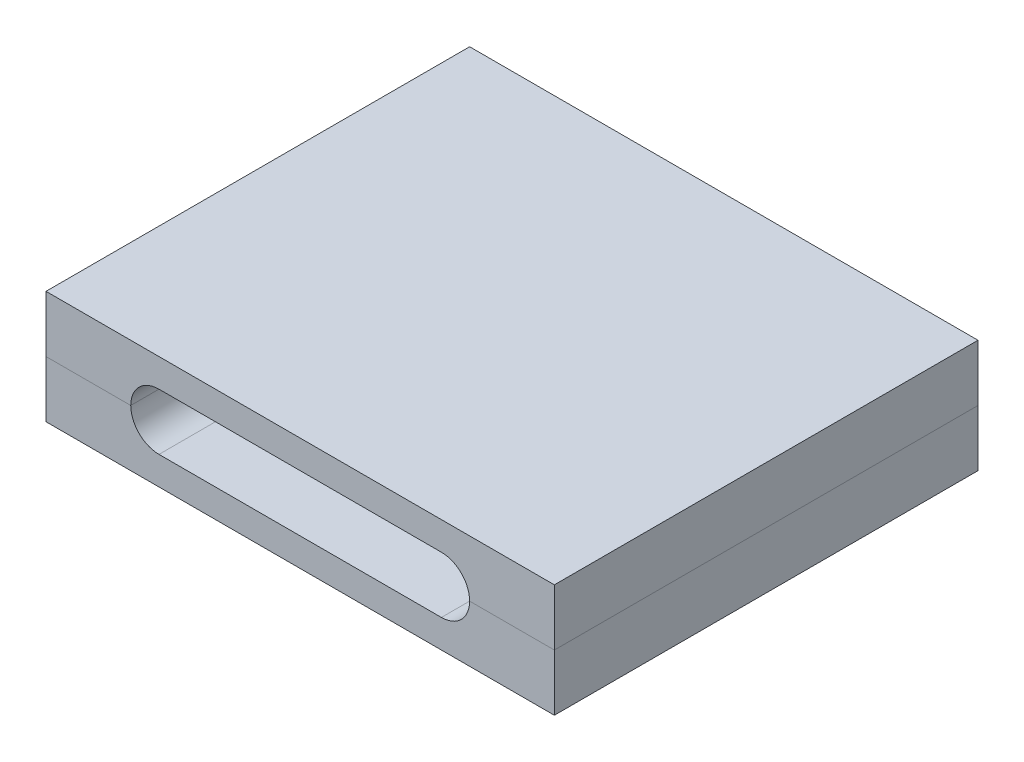
ISO-10303-21;
HEADER;
FILE_DESCRIPTION(('STEP AP214'),'2;1');
FILE_NAME('part.step','',(''),(''),'','','');
FILE_SCHEMA(('AUTOMOTIVE_DESIGN { 1 0 10303 214 1 1 1 1 }'));
ENDSEC;
DATA;
#1=APPLICATION_CONTEXT('core data for automotive mechanical design processes');
#2=APPLICATION_PROTOCOL_DEFINITION('international standard','automotive_design',2000,#1);
#3=PRODUCT_CONTEXT('',#1,'mechanical');
#4=PRODUCT('Part','Part','',(#3));
#5=PRODUCT_RELATED_PRODUCT_CATEGORY('part','',(#4));
#6=PRODUCT_DEFINITION_FORMATION('','',#4);
#7=PRODUCT_DEFINITION_CONTEXT('part definition',#1,'design');
#8=PRODUCT_DEFINITION('design','',#6,#7);
#9=PRODUCT_DEFINITION_SHAPE('','',#8);
#10=(LENGTH_UNIT() NAMED_UNIT(*) SI_UNIT(.MILLI.,.METRE.));
#11=(NAMED_UNIT(*) PLANE_ANGLE_UNIT() SI_UNIT($,.RADIAN.));
#12=(NAMED_UNIT(*) SI_UNIT($,.STERADIAN.) SOLID_ANGLE_UNIT());
#13=UNCERTAINTY_MEASURE_WITH_UNIT(LENGTH_MEASURE(1.E-05),#10,'distance_accuracy_value','');
#14=(GEOMETRIC_REPRESENTATION_CONTEXT(3) GLOBAL_UNCERTAINTY_ASSIGNED_CONTEXT((#13)) GLOBAL_UNIT_ASSIGNED_CONTEXT((#10,
#11,#12)) REPRESENTATION_CONTEXT('',''));
#15=CARTESIAN_POINT('',(0.,0.,0.));
#16=DIRECTION('',(0.,0.,1.));
#17=DIRECTION('',(1.,0.,0.));
#18=AXIS2_PLACEMENT_3D('',#15,#16,#17);
#19=CARTESIAN_POINT('',(9.,0.,-0.00999999999999959));
#20=DIRECTION('',(0.,1.,0.));
#21=DIRECTION('',(0.,0.,1.));
#22=AXIS2_PLACEMENT_3D('',#19,#20,#21);
#23=PLANE('',#22);
#24=DIRECTION('',(0.,0.,-1.));
#25=VECTOR('',#24,1.);
#26=CARTESIAN_POINT('',(-6.,0.,15.));
#27=LINE('',#26,#25);
#28=CARTESIAN_POINT('',(-6.,0.,0.));
#29=VERTEX_POINT('',#28);
#30=CARTESIAN_POINT('',(-6.,0.,15.));
#31=VERTEX_POINT('',#30);
#32=EDGE_CURVE('E150',#29,#31,#27,.F.);
#33=ORIENTED_EDGE('',*,*,#32,.F.);
#34=DIRECTION('',(-1.,0.,0.));
#35=VECTOR('',#34,1.);
#36=CARTESIAN_POINT('',(0.,0.,0.));
#37=LINE('',#36,#35);
#38=CARTESIAN_POINT('',(-9.,0.,0.));
#39=VERTEX_POINT('',#38);
#40=EDGE_CURVE('E157',#29,#39,#37,.T.);
#41=ORIENTED_EDGE('',*,*,#40,.T.);
#42=DIRECTION('',(0.,0.,1.));
#43=VECTOR('',#42,1.);
#44=CARTESIAN_POINT('',(-9.,0.,15.));
#45=LINE('',#44,#43);
#46=CARTESIAN_POINT('',(-9.,0.,15.));
#47=VERTEX_POINT('',#46);
#48=EDGE_CURVE('E166',#39,#47,#45,.T.);
#49=ORIENTED_EDGE('',*,*,#48,.T.);
#50=DIRECTION('',(-1.,0.,0.));
#51=VECTOR('',#50,1.);
#52=CARTESIAN_POINT('',(0.,0.,15.));
#53=LINE('',#52,#51);
#54=EDGE_CURVE('E109',#31,#47,#53,.T.);
#55=ORIENTED_EDGE('',*,*,#54,.F.);
#56=EDGE_LOOP('',(#33,#41,#49,#55));
#57=FACE_BOUND('',#56,.T.);
#58=ADVANCED_FACE('F49',(#57),#23,.T.);
#59=DIRECTION('',(0.,0.,-1.));
#60=VECTOR('',#59,1.);
#61=CARTESIAN_POINT('',(9.,0.,15.));
#62=LINE('',#61,#60);
#63=CARTESIAN_POINT('',(9.,0.,15.));
#64=VERTEX_POINT('',#63);
#65=CARTESIAN_POINT('',(9.,0.,0.));
#66=VERTEX_POINT('',#65);
#67=EDGE_CURVE('E162',#64,#66,#62,.T.);
#68=ORIENTED_EDGE('',*,*,#67,.T.);
#69=CARTESIAN_POINT('',(6.,0.,0.));
#70=VERTEX_POINT('',#69);
#71=EDGE_CURVE('E161',#66,#70,#37,.T.);
#72=ORIENTED_EDGE('',*,*,#71,.T.);
#73=DIRECTION('',(0.,0.,-1.));
#74=VECTOR('',#73,1.);
#75=CARTESIAN_POINT('',(6.,0.,15.));
#76=LINE('',#75,#74);
#77=CARTESIAN_POINT('',(6.,0.,15.));
#78=VERTEX_POINT('',#77);
#79=EDGE_CURVE('E120',#78,#70,#76,.T.);
#80=ORIENTED_EDGE('',*,*,#79,.F.);
#81=EDGE_CURVE('E156',#64,#78,#53,.T.);
#82=ORIENTED_EDGE('',*,*,#81,.F.);
#83=EDGE_LOOP('',(#68,#72,#80,#82));
#84=FACE_BOUND('',#83,.T.);
#85=ADVANCED_FACE('F195',(#84),#23,.T.);
#86=CARTESIAN_POINT('',(-9.,-2.,15.));
#87=DIRECTION('',(0.,1.,0.));
#88=DIRECTION('',(0.,0.,1.));
#89=AXIS2_PLACEMENT_3D('',#86,#87,#88);
#90=PLANE('',#89);
#91=DIRECTION('',(1.,0.,0.));
#92=VECTOR('',#91,1.);
#93=CARTESIAN_POINT('',(-9.,-2.,0.));
#94=LINE('',#93,#92);
#95=CARTESIAN_POINT('',(-9.,-2.,0.));
#96=VERTEX_POINT('',#95);
#97=CARTESIAN_POINT('',(9.,-2.,0.));
#98=VERTEX_POINT('',#97);
#99=EDGE_CURVE('E131',#96,#98,#94,.T.);
#100=ORIENTED_EDGE('',*,*,#99,.T.);
#101=DIRECTION('',(0.,0.,-1.));
#102=VECTOR('',#101,1.);
#103=CARTESIAN_POINT('',(9.,-2.,15.));
#104=LINE('',#103,#102);
#105=CARTESIAN_POINT('',(9.,-2.,15.));
#106=VERTEX_POINT('',#105);
#107=EDGE_CURVE('E119',#106,#98,#104,.T.);
#108=ORIENTED_EDGE('',*,*,#107,.F.);
#109=DIRECTION('',(1.,0.,0.));
#110=VECTOR('',#109,1.);
#111=CARTESIAN_POINT('',(-9.,-2.,15.));
#112=LINE('',#111,#110);
#113=CARTESIAN_POINT('',(-9.,-2.,15.));
#114=VERTEX_POINT('',#113);
#115=EDGE_CURVE('E104',#114,#106,#112,.T.);
#116=ORIENTED_EDGE('',*,*,#115,.F.);
#117=DIRECTION('',(0.,0.,-1.));
#118=VECTOR('',#117,1.);
#119=CARTESIAN_POINT('',(-9.,-2.,15.));
#120=LINE('',#119,#118);
#121=EDGE_CURVE('E114',#114,#96,#120,.T.);
#122=ORIENTED_EDGE('',*,*,#121,.T.);
#123=EDGE_LOOP('',(#100,#108,#116,#122));
#124=FACE_BOUND('',#123,.T.);
#125=ADVANCED_FACE('F122',(#124),#90,.F.);
#126=CARTESIAN_POINT('',(-5.,-1.,15.));
#127=DIRECTION('',(0.,1.,0.));
#128=DIRECTION('',(-1.,0.,0.));
#129=AXIS2_PLACEMENT_3D('',#126,#127,#128);
#130=PLANE('',#129);
#131=DIRECTION('',(1.,0.,0.));
#132=VECTOR('',#131,1.);
#133=CARTESIAN_POINT('',(-5.,-1.,0.));
#134=LINE('',#133,#132);
#135=CARTESIAN_POINT('',(-5.,-1.,0.));
#136=VERTEX_POINT('',#135);
#137=CARTESIAN_POINT('',(5.,-1.,0.));
#138=VERTEX_POINT('',#137);
#139=EDGE_CURVE('E59',#136,#138,#134,.T.);
#140=ORIENTED_EDGE('',*,*,#139,.F.);
#141=DIRECTION('',(0.,0.,-1.));
#142=VECTOR('',#141,1.);
#143=CARTESIAN_POINT('',(-5.,-1.,15.));
#144=LINE('',#143,#142);
#145=CARTESIAN_POINT('',(-5.,-1.,15.));
#146=VERTEX_POINT('',#145);
#147=EDGE_CURVE('E132',#146,#136,#144,.T.);
#148=ORIENTED_EDGE('',*,*,#147,.F.);
#149=DIRECTION('',(1.,0.,0.));
#150=VECTOR('',#149,1.);
#151=CARTESIAN_POINT('',(-5.,-1.,15.));
#152=LINE('',#151,#150);
#153=CARTESIAN_POINT('',(5.,-1.,15.));
#154=VERTEX_POINT('',#153);
#155=EDGE_CURVE('E76',#146,#154,#152,.T.);
#156=ORIENTED_EDGE('',*,*,#155,.T.);
#157=DIRECTION('',(0.,0.,-1.));
#158=VECTOR('',#157,1.);
#159=CARTESIAN_POINT('',(5.,-1.,15.));
#160=LINE('',#159,#158);
#161=EDGE_CURVE('E136',#154,#138,#160,.T.);
#162=ORIENTED_EDGE('',*,*,#161,.T.);
#163=EDGE_LOOP('',(#140,#148,#156,#162));
#164=FACE_BOUND('',#163,.T.);
#165=ADVANCED_FACE('F217',(#164),#130,.T.);
#166=CARTESIAN_POINT('',(0.,0.,0.));
#167=DIRECTION('',(0.,0.,1.));
#168=DIRECTION('',(1.,0.,0.));
#169=AXIS2_PLACEMENT_3D('',#166,#167,#168);
#170=PLANE('',#169);
#171=ORIENTED_EDGE('',*,*,#71,.F.);
#172=DIRECTION('',(0.,1.,0.));
#173=VECTOR('',#172,1.);
#174=CARTESIAN_POINT('',(9.,2.,0.));
#175=LINE('',#174,#173);
#176=EDGE_CURVE('E137',#98,#66,#175,.T.);
#177=ORIENTED_EDGE('',*,*,#176,.F.);
#178=ORIENTED_EDGE('',*,*,#99,.F.);
#179=DIRECTION('',(0.,-1.,0.));
#180=VECTOR('',#179,1.);
#181=CARTESIAN_POINT('',(-9.,2.,0.));
#182=LINE('',#181,#180);
#183=EDGE_CURVE('E86',#39,#96,#182,.T.);
#184=ORIENTED_EDGE('',*,*,#183,.F.);
#185=ORIENTED_EDGE('',*,*,#40,.F.);
#186=CARTESIAN_POINT('',(-5.,0.,0.));
#187=DIRECTION('',(0.,0.,1.));
#188=DIRECTION('',(1.,0.,0.));
#189=AXIS2_PLACEMENT_3D('',#186,#187,#188);
#190=CIRCLE('',#189,1.);
#191=EDGE_CURVE('E12',#29,#136,#190,.T.);
#192=ORIENTED_EDGE('',*,*,#191,.T.);
#193=ORIENTED_EDGE('',*,*,#139,.T.);
#194=CARTESIAN_POINT('',(5.,0.,0.));
#195=DIRECTION('',(0.,0.,1.));
#196=DIRECTION('',(1.,0.,0.));
#197=AXIS2_PLACEMENT_3D('',#194,#195,#196);
#198=CIRCLE('',#197,1.);
#199=EDGE_CURVE('E143',#138,#70,#198,.T.);
#200=ORIENTED_EDGE('',*,*,#199,.T.);
#201=EDGE_LOOP('',(#171,#177,#178,#184,#185,#192,#193,#200));
#202=FACE_BOUND('',#201,.T.);
#203=ADVANCED_FACE('F184',(#202),#170,.F.);
#204=CARTESIAN_POINT('',(0.,0.,15.));
#205=DIRECTION('',(0.,0.,1.));
#206=DIRECTION('',(1.,0.,0.));
#207=AXIS2_PLACEMENT_3D('',#204,#205,#206);
#208=PLANE('',#207);
#209=DIRECTION('',(0.,1.,0.));
#210=VECTOR('',#209,1.);
#211=CARTESIAN_POINT('',(9.,2.,15.));
#212=LINE('',#211,#210);
#213=EDGE_CURVE('E112',#106,#64,#212,.T.);
#214=ORIENTED_EDGE('',*,*,#213,.T.);
#215=ORIENTED_EDGE('',*,*,#81,.T.);
#216=CARTESIAN_POINT('',(5.,0.,15.));
#217=DIRECTION('',(0.,0.,1.));
#218=DIRECTION('',(1.,0.,0.));
#219=AXIS2_PLACEMENT_3D('',#216,#217,#218);
#220=CIRCLE('',#219,1.);
#221=EDGE_CURVE('E140',#154,#78,#220,.T.);
#222=ORIENTED_EDGE('',*,*,#221,.F.);
#223=ORIENTED_EDGE('',*,*,#155,.F.);
#224=CARTESIAN_POINT('',(-5.,0.,15.));
#225=DIRECTION('',(0.,0.,1.));
#226=DIRECTION('',(1.,0.,0.));
#227=AXIS2_PLACEMENT_3D('',#224,#225,#226);
#228=CIRCLE('',#227,1.);
#229=EDGE_CURVE('E146',#31,#146,#228,.T.);
#230=ORIENTED_EDGE('',*,*,#229,.F.);
#231=ORIENTED_EDGE('',*,*,#54,.T.);
#232=DIRECTION('',(0.,-1.,0.));
#233=VECTOR('',#232,1.);
#234=CARTESIAN_POINT('',(-9.,2.,15.));
#235=LINE('',#234,#233);
#236=EDGE_CURVE('E100',#47,#114,#235,.T.);
#237=ORIENTED_EDGE('',*,*,#236,.T.);
#238=ORIENTED_EDGE('',*,*,#115,.T.);
#239=EDGE_LOOP('',(#214,#215,#222,#223,#230,#231,#237,#238));
#240=FACE_BOUND('',#239,.T.);
#241=ADVANCED_FACE('F102',(#240),#208,.T.);
#242=CARTESIAN_POINT('',(5.,0.,15.));
#243=DIRECTION('',(0.,0.,-1.));
#244=DIRECTION('',(-1.,0.,0.));
#245=AXIS2_PLACEMENT_3D('',#242,#243,#244);
#246=CYLINDRICAL_SURFACE('',#245,1.);
#247=ORIENTED_EDGE('',*,*,#221,.T.);
#248=ORIENTED_EDGE('',*,*,#79,.T.);
#249=ORIENTED_EDGE('',*,*,#199,.F.);
#250=ORIENTED_EDGE('',*,*,#161,.F.);
#251=EDGE_LOOP('',(#247,#248,#249,#250));
#252=FACE_BOUND('',#251,.T.);
#253=ADVANCED_FACE('F51',(#252),#246,.F.);
#254=CARTESIAN_POINT('',(-5.,0.,15.));
#255=DIRECTION('',(0.,0.,-1.));
#256=DIRECTION('',(-1.,0.,0.));
#257=AXIS2_PLACEMENT_3D('',#254,#255,#256);
#258=CYLINDRICAL_SURFACE('',#257,1.);
#259=ORIENTED_EDGE('',*,*,#191,.F.);
#260=ORIENTED_EDGE('',*,*,#32,.T.);
#261=ORIENTED_EDGE('',*,*,#229,.T.);
#262=ORIENTED_EDGE('',*,*,#147,.T.);
#263=EDGE_LOOP('',(#259,#260,#261,#262));
#264=FACE_BOUND('',#263,.T.);
#265=ADVANCED_FACE('F214',(#264),#258,.F.);
#266=CARTESIAN_POINT('',(-9.,2.,15.));
#267=DIRECTION('',(1.,0.,0.));
#268=DIRECTION('',(0.,0.,-1.));
#269=AXIS2_PLACEMENT_3D('',#266,#267,#268);
#270=PLANE('',#269);
#271=ORIENTED_EDGE('',*,*,#48,.F.);
#272=ORIENTED_EDGE('',*,*,#183,.T.);
#273=ORIENTED_EDGE('',*,*,#121,.F.);
#274=ORIENTED_EDGE('',*,*,#236,.F.);
#275=EDGE_LOOP('',(#271,#272,#273,#274));
#276=FACE_BOUND('',#275,.T.);
#277=ADVANCED_FACE('F115',(#276),#270,.F.);
#278=CARTESIAN_POINT('',(9.,2.,15.));
#279=DIRECTION('',(-1.,0.,0.));
#280=DIRECTION('',(0.,0.,1.));
#281=AXIS2_PLACEMENT_3D('',#278,#279,#280);
#282=PLANE('',#281);
#283=ORIENTED_EDGE('',*,*,#67,.F.);
#284=ORIENTED_EDGE('',*,*,#213,.F.);
#285=ORIENTED_EDGE('',*,*,#107,.T.);
#286=ORIENTED_EDGE('',*,*,#176,.T.);
#287=EDGE_LOOP('',(#283,#284,#285,#286));
#288=FACE_BOUND('',#287,.T.);
#289=ADVANCED_FACE('F205',(#288),#282,.F.);
#290=CLOSED_SHELL('',(#58,#85,#125,#165,#203,#241,#253,#265,#277,#289));
#291=MANIFOLD_SOLID_BREP('B2',#290);
#292=CARTESIAN_POINT('',(9.,0.,-0.00999999999999959));
#293=DIRECTION('',(0.,1.,0.));
#294=DIRECTION('',(0.,0.,1.));
#295=AXIS2_PLACEMENT_3D('',#292,#293,#294);
#296=PLANE('',#295);
#297=DIRECTION('',(0.,0.,-1.));
#298=VECTOR('',#297,1.);
#299=CARTESIAN_POINT('',(-6.,0.,15.));
#300=LINE('',#299,#298);
#301=CARTESIAN_POINT('',(-6.,0.,0.));
#302=VERTEX_POINT('',#301);
#303=CARTESIAN_POINT('',(-6.,0.,15.));
#304=VERTEX_POINT('',#303);
#305=EDGE_CURVE('E301',#302,#304,#300,.F.);
#306=ORIENTED_EDGE('',*,*,#305,.T.);
#307=DIRECTION('',(-1.,0.,0.));
#308=VECTOR('',#307,1.);
#309=CARTESIAN_POINT('',(0.,0.,15.));
#310=LINE('',#309,#308);
#311=CARTESIAN_POINT('',(-9.,0.,15.));
#312=VERTEX_POINT('',#311);
#313=EDGE_CURVE('E386',#304,#312,#310,.T.);
#314=ORIENTED_EDGE('',*,*,#313,.T.);
#315=DIRECTION('',(0.,0.,1.));
#316=VECTOR('',#315,1.);
#317=CARTESIAN_POINT('',(-9.,0.,15.));
#318=LINE('',#317,#316);
#319=CARTESIAN_POINT('',(-9.,0.,0.));
#320=VERTEX_POINT('',#319);
#321=EDGE_CURVE('E415',#320,#312,#318,.T.);
#322=ORIENTED_EDGE('',*,*,#321,.F.);
#323=DIRECTION('',(-1.,0.,0.));
#324=VECTOR('',#323,1.);
#325=CARTESIAN_POINT('',(0.,0.,0.));
#326=LINE('',#325,#324);
#327=EDGE_CURVE('E421',#302,#320,#326,.T.);
#328=ORIENTED_EDGE('',*,*,#327,.F.);
#329=EDGE_LOOP('',(#306,#314,#322,#328));
#330=FACE_BOUND('',#329,.T.);
#331=ADVANCED_FACE('F298',(#330),#296,.F.);
#332=DIRECTION('',(0.,0.,-1.));
#333=VECTOR('',#332,1.);
#334=CARTESIAN_POINT('',(9.,0.,15.));
#335=LINE('',#334,#333);
#336=CARTESIAN_POINT('',(9.,0.,15.));
#337=VERTEX_POINT('',#336);
#338=CARTESIAN_POINT('',(9.,0.,0.));
#339=VERTEX_POINT('',#338);
#340=EDGE_CURVE('E418',#337,#339,#335,.T.);
#341=ORIENTED_EDGE('',*,*,#340,.F.);
#342=CARTESIAN_POINT('',(6.,0.,15.));
#343=VERTEX_POINT('',#342);
#344=EDGE_CURVE('E422',#337,#343,#310,.T.);
#345=ORIENTED_EDGE('',*,*,#344,.T.);
#346=DIRECTION('',(0.,0.,-1.));
#347=VECTOR('',#346,1.);
#348=CARTESIAN_POINT('',(6.,0.,15.));
#349=LINE('',#348,#347);
#350=CARTESIAN_POINT('',(6.,0.,0.));
#351=VERTEX_POINT('',#350);
#352=EDGE_CURVE('E47',#343,#351,#349,.T.);
#353=ORIENTED_EDGE('',*,*,#352,.T.);
#354=EDGE_CURVE('E313',#339,#351,#326,.T.);
#355=ORIENTED_EDGE('',*,*,#354,.F.);
#356=EDGE_LOOP('',(#341,#345,#353,#355));
#357=FACE_BOUND('',#356,.T.);
#358=ADVANCED_FACE('F441',(#357),#296,.F.);
#359=CARTESIAN_POINT('',(0.,0.,15.));
#360=DIRECTION('',(0.,0.,1.));
#361=DIRECTION('',(1.,0.,0.));
#362=AXIS2_PLACEMENT_3D('',#359,#360,#361);
#363=PLANE('',#362);
#364=ORIENTED_EDGE('',*,*,#344,.F.);
#365=DIRECTION('',(0.,1.,0.));
#366=VECTOR('',#365,1.);
#367=CARTESIAN_POINT('',(9.,2.,15.));
#368=LINE('',#367,#366);
#369=CARTESIAN_POINT('',(9.,2.,15.));
#370=VERTEX_POINT('',#369);
#371=EDGE_CURVE('E398',#337,#370,#368,.T.);
#372=ORIENTED_EDGE('',*,*,#371,.T.);
#373=DIRECTION('',(-1.,0.,0.));
#374=VECTOR('',#373,1.);
#375=CARTESIAN_POINT('',(-9.,2.,15.));
#376=LINE('',#375,#374);
#377=CARTESIAN_POINT('',(-9.,2.,15.));
#378=VERTEX_POINT('',#377);
#379=EDGE_CURVE('E400',#370,#378,#376,.T.);
#380=ORIENTED_EDGE('',*,*,#379,.T.);
#381=DIRECTION('',(0.,-1.,0.));
#382=VECTOR('',#381,1.);
#383=CARTESIAN_POINT('',(-9.,2.,15.));
#384=LINE('',#383,#382);
#385=EDGE_CURVE('E403',#378,#312,#384,.T.);
#386=ORIENTED_EDGE('',*,*,#385,.T.);
#387=ORIENTED_EDGE('',*,*,#313,.F.);
#388=CARTESIAN_POINT('',(-5.,0.,15.));
#389=DIRECTION('',(0.,0.,1.));
#390=DIRECTION('',(1.,0.,0.));
#391=AXIS2_PLACEMENT_3D('',#388,#389,#390);
#392=CIRCLE('',#391,1.);
#393=CARTESIAN_POINT('',(-5.,1.,15.));
#394=VERTEX_POINT('',#393);
#395=EDGE_CURVE('E379',#394,#304,#392,.T.);
#396=ORIENTED_EDGE('',*,*,#395,.F.);
#397=DIRECTION('',(-1.,0.,0.));
#398=VECTOR('',#397,1.);
#399=CARTESIAN_POINT('',(-5.,1.,15.));
#400=LINE('',#399,#398);
#401=CARTESIAN_POINT('',(5.,1.,15.));
#402=VERTEX_POINT('',#401);
#403=EDGE_CURVE('E362',#402,#394,#400,.T.);
#404=ORIENTED_EDGE('',*,*,#403,.F.);
#405=CARTESIAN_POINT('',(5.,0.,15.));
#406=DIRECTION('',(0.,0.,1.));
#407=DIRECTION('',(1.,0.,0.));
#408=AXIS2_PLACEMENT_3D('',#405,#406,#407);
#409=CIRCLE('',#408,1.);
#410=EDGE_CURVE('E373',#343,#402,#409,.T.);
#411=ORIENTED_EDGE('',*,*,#410,.F.);
#412=EDGE_LOOP('',(#364,#372,#380,#386,#387,#396,#404,#411));
#413=FACE_BOUND('',#412,.T.);
#414=ADVANCED_FACE('F383',(#413),#363,.T.);
#415=CARTESIAN_POINT('',(0.,0.,0.));
#416=DIRECTION('',(0.,0.,1.));
#417=DIRECTION('',(1.,0.,0.));
#418=AXIS2_PLACEMENT_3D('',#415,#416,#417);
#419=PLANE('',#418);
#420=DIRECTION('',(0.,1.,0.));
#421=VECTOR('',#420,1.);
#422=CARTESIAN_POINT('',(9.,2.,0.));
#423=LINE('',#422,#421);
#424=CARTESIAN_POINT('',(9.,2.,0.));
#425=VERTEX_POINT('',#424);
#426=EDGE_CURVE('E397',#339,#425,#423,.T.);
#427=ORIENTED_EDGE('',*,*,#426,.F.);
#428=ORIENTED_EDGE('',*,*,#354,.T.);
#429=CARTESIAN_POINT('',(5.,0.,0.));
#430=DIRECTION('',(0.,0.,1.));
#431=DIRECTION('',(1.,0.,0.));
#432=AXIS2_PLACEMENT_3D('',#429,#430,#431);
#433=CIRCLE('',#432,1.);
#434=CARTESIAN_POINT('',(5.,1.,0.));
#435=VERTEX_POINT('',#434);
#436=EDGE_CURVE('E391',#351,#435,#433,.T.);
#437=ORIENTED_EDGE('',*,*,#436,.T.);
#438=DIRECTION('',(-1.,0.,0.));
#439=VECTOR('',#438,1.);
#440=CARTESIAN_POINT('',(-5.,1.,0.));
#441=LINE('',#440,#439);
#442=CARTESIAN_POINT('',(-5.,1.,0.));
#443=VERTEX_POINT('',#442);
#444=EDGE_CURVE('E388',#435,#443,#441,.T.);
#445=ORIENTED_EDGE('',*,*,#444,.T.);
#446=CARTESIAN_POINT('',(-5.,0.,0.));
#447=DIRECTION('',(0.,0.,1.));
#448=DIRECTION('',(1.,0.,0.));
#449=AXIS2_PLACEMENT_3D('',#446,#447,#448);
#450=CIRCLE('',#449,1.);
#451=EDGE_CURVE('E381',#443,#302,#450,.T.);
#452=ORIENTED_EDGE('',*,*,#451,.T.);
#453=ORIENTED_EDGE('',*,*,#327,.T.);
#454=DIRECTION('',(0.,-1.,0.));
#455=VECTOR('',#454,1.);
#456=CARTESIAN_POINT('',(-9.,2.,0.));
#457=LINE('',#456,#455);
#458=CARTESIAN_POINT('',(-9.,2.,0.));
#459=VERTEX_POINT('',#458);
#460=EDGE_CURVE('E401',#459,#320,#457,.T.);
#461=ORIENTED_EDGE('',*,*,#460,.F.);
#462=DIRECTION('',(-1.,0.,0.));
#463=VECTOR('',#462,1.);
#464=CARTESIAN_POINT('',(-9.,2.,0.));
#465=LINE('',#464,#463);
#466=EDGE_CURVE('E407',#425,#459,#465,.T.);
#467=ORIENTED_EDGE('',*,*,#466,.F.);
#468=EDGE_LOOP('',(#427,#428,#437,#445,#452,#453,#461,#467));
#469=FACE_BOUND('',#468,.T.);
#470=ADVANCED_FACE('F425',(#469),#419,.F.);
#471=CARTESIAN_POINT('',(9.,2.,15.));
#472=DIRECTION('',(-1.,0.,0.));
#473=DIRECTION('',(0.,0.,1.));
#474=AXIS2_PLACEMENT_3D('',#471,#472,#473);
#475=PLANE('',#474);
#476=ORIENTED_EDGE('',*,*,#371,.F.);
#477=ORIENTED_EDGE('',*,*,#340,.T.);
#478=ORIENTED_EDGE('',*,*,#426,.T.);
#479=DIRECTION('',(0.,0.,-1.));
#480=VECTOR('',#479,1.);
#481=CARTESIAN_POINT('',(9.,2.,15.));
#482=LINE('',#481,#480);
#483=EDGE_CURVE('E413',#370,#425,#482,.T.);
#484=ORIENTED_EDGE('',*,*,#483,.F.);
#485=EDGE_LOOP('',(#476,#477,#478,#484));
#486=FACE_BOUND('',#485,.T.);
#487=ADVANCED_FACE('F438',(#486),#475,.F.);
#488=CARTESIAN_POINT('',(-9.,2.,15.));
#489=DIRECTION('',(0.,-1.,0.));
#490=DIRECTION('',(0.,0.,-1.));
#491=AXIS2_PLACEMENT_3D('',#488,#489,#490);
#492=PLANE('',#491);
#493=ORIENTED_EDGE('',*,*,#466,.T.);
#494=DIRECTION('',(0.,0.,-1.));
#495=VECTOR('',#494,1.);
#496=CARTESIAN_POINT('',(-9.,2.,15.));
#497=LINE('',#496,#495);
#498=EDGE_CURVE('E405',#378,#459,#497,.T.);
#499=ORIENTED_EDGE('',*,*,#498,.F.);
#500=ORIENTED_EDGE('',*,*,#379,.F.);
#501=ORIENTED_EDGE('',*,*,#483,.T.);
#502=EDGE_LOOP('',(#493,#499,#500,#501));
#503=FACE_BOUND('',#502,.T.);
#504=ADVANCED_FACE('F434',(#503),#492,.F.);
#505=CARTESIAN_POINT('',(-9.,2.,15.));
#506=DIRECTION('',(1.,0.,0.));
#507=DIRECTION('',(0.,0.,-1.));
#508=AXIS2_PLACEMENT_3D('',#505,#506,#507);
#509=PLANE('',#508);
#510=ORIENTED_EDGE('',*,*,#460,.T.);
#511=ORIENTED_EDGE('',*,*,#321,.T.);
#512=ORIENTED_EDGE('',*,*,#385,.F.);
#513=ORIENTED_EDGE('',*,*,#498,.T.);
#514=EDGE_LOOP('',(#510,#511,#512,#513));
#515=FACE_BOUND('',#514,.T.);
#516=ADVANCED_FACE('F430',(#515),#509,.F.);
#517=CARTESIAN_POINT('',(-5.,0.,15.));
#518=DIRECTION('',(0.,0.,-1.));
#519=DIRECTION('',(-1.,0.,0.));
#520=AXIS2_PLACEMENT_3D('',#517,#518,#519);
#521=CYLINDRICAL_SURFACE('',#520,1.);
#522=ORIENTED_EDGE('',*,*,#305,.F.);
#523=ORIENTED_EDGE('',*,*,#451,.F.);
#524=DIRECTION('',(0.,0.,-1.));
#525=VECTOR('',#524,1.);
#526=CARTESIAN_POINT('',(-5.,1.,15.));
#527=LINE('',#526,#525);
#528=EDGE_CURVE('E366',#394,#443,#527,.T.);
#529=ORIENTED_EDGE('',*,*,#528,.F.);
#530=ORIENTED_EDGE('',*,*,#395,.T.);
#531=EDGE_LOOP('',(#522,#523,#529,#530));
#532=FACE_BOUND('',#531,.T.);
#533=ADVANCED_FACE('F378',(#532),#521,.F.);
#534=CARTESIAN_POINT('',(5.,0.,15.));
#535=DIRECTION('',(0.,0.,-1.));
#536=DIRECTION('',(-1.,0.,0.));
#537=AXIS2_PLACEMENT_3D('',#534,#535,#536);
#538=CYLINDRICAL_SURFACE('',#537,1.);
#539=ORIENTED_EDGE('',*,*,#352,.F.);
#540=ORIENTED_EDGE('',*,*,#410,.T.);
#541=DIRECTION('',(0.,0.,-1.));
#542=VECTOR('',#541,1.);
#543=CARTESIAN_POINT('',(5.,1.,15.));
#544=LINE('',#543,#542);
#545=EDGE_CURVE('E369',#402,#435,#544,.T.);
#546=ORIENTED_EDGE('',*,*,#545,.T.);
#547=ORIENTED_EDGE('',*,*,#436,.F.);
#548=EDGE_LOOP('',(#539,#540,#546,#547));
#549=FACE_BOUND('',#548,.T.);
#550=ADVANCED_FACE('F442',(#549),#538,.F.);
#551=CARTESIAN_POINT('',(-5.,1.,15.));
#552=DIRECTION('',(0.,-1.,0.));
#553=DIRECTION('',(1.,0.,0.));
#554=AXIS2_PLACEMENT_3D('',#551,#552,#553);
#555=PLANE('',#554);
#556=ORIENTED_EDGE('',*,*,#444,.F.);
#557=ORIENTED_EDGE('',*,*,#545,.F.);
#558=ORIENTED_EDGE('',*,*,#403,.T.);
#559=ORIENTED_EDGE('',*,*,#528,.T.);
#560=EDGE_LOOP('',(#556,#557,#558,#559));
#561=FACE_BOUND('',#560,.T.);
#562=ADVANCED_FACE('F365',(#561),#555,.T.);
#563=CLOSED_SHELL('',(#331,#358,#414,#470,#487,#504,#516,#533,#550,#562));
#564=MANIFOLD_SOLID_BREP('B6',#563);
#565=ADVANCED_BREP_SHAPE_REPRESENTATION('',(#18,#291,#564),#14);
#566=SHAPE_DEFINITION_REPRESENTATION(#9,#565);
ENDSEC;
END-ISO-10303-21;
